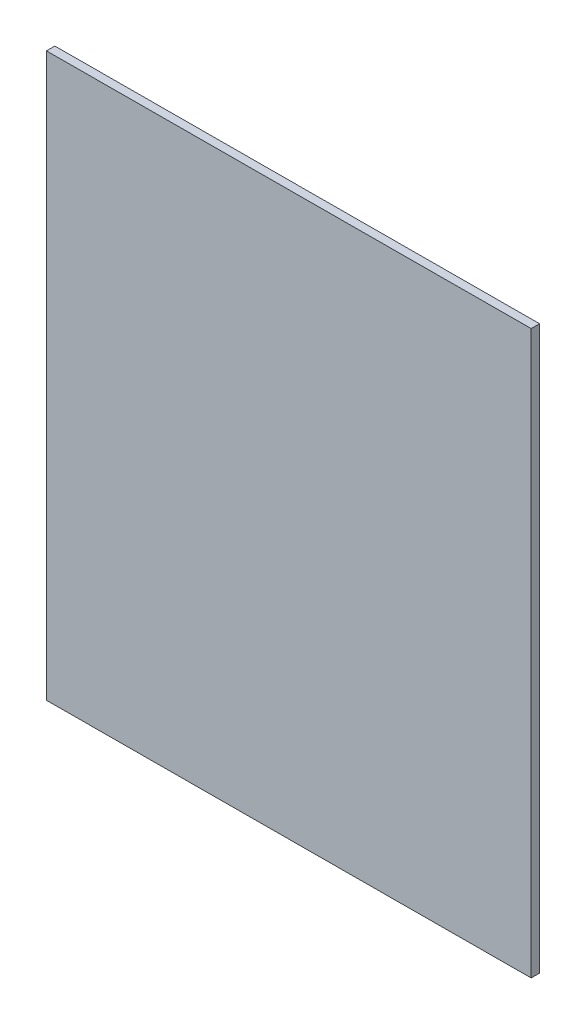
ISO-10303-21;
HEADER;
FILE_DESCRIPTION(('STEP AP214'),'2;1');
FILE_NAME('part.step','',(''),(''),'','','');
FILE_SCHEMA(('AUTOMOTIVE_DESIGN { 1 0 10303 214 1 1 1 1 }'));
ENDSEC;
DATA;
#1=APPLICATION_CONTEXT('core data for automotive mechanical design processes');
#2=APPLICATION_PROTOCOL_DEFINITION('international standard','automotive_design',2000,#1);
#3=PRODUCT_CONTEXT('',#1,'mechanical');
#4=PRODUCT('Part','Part','',(#3));
#5=PRODUCT_RELATED_PRODUCT_CATEGORY('part','',(#4));
#6=PRODUCT_DEFINITION_FORMATION('','',#4);
#7=PRODUCT_DEFINITION_CONTEXT('part definition',#1,'design');
#8=PRODUCT_DEFINITION('design','',#6,#7);
#9=PRODUCT_DEFINITION_SHAPE('','',#8);
#10=(LENGTH_UNIT() NAMED_UNIT(*) SI_UNIT(.MILLI.,.METRE.));
#11=(NAMED_UNIT(*) PLANE_ANGLE_UNIT() SI_UNIT($,.RADIAN.));
#12=(NAMED_UNIT(*) SI_UNIT($,.STERADIAN.) SOLID_ANGLE_UNIT());
#13=UNCERTAINTY_MEASURE_WITH_UNIT(LENGTH_MEASURE(1.E-05),#10,'distance_accuracy_value','');
#14=(GEOMETRIC_REPRESENTATION_CONTEXT(3) GLOBAL_UNCERTAINTY_ASSIGNED_CONTEXT((#13)) GLOBAL_UNIT_ASSIGNED_CONTEXT((#10,
#11,#12)) REPRESENTATION_CONTEXT('',''));
#15=CARTESIAN_POINT('',(0.,0.,0.));
#16=DIRECTION('',(0.,0.,1.));
#17=DIRECTION('',(1.,0.,0.));
#18=AXIS2_PLACEMENT_3D('',#15,#16,#17);
#19=CARTESIAN_POINT('',(-57.6000536662766,258.864031921605,-19.7746340834228));
#20=DIRECTION('',(0.,1.,0.));
#21=DIRECTION('',(0.,0.,1.));
#22=AXIS2_PLACEMENT_3D('',#19,#20,#21);
#23=PLANE('',#22);
#24=DIRECTION('',(0.999992480483627,0.,-0.00387801188796971));
#25=VECTOR('',#24,1.);
#26=CARTESIAN_POINT('',(-57.6078096900525,258.864031921605,-21.7746190443901));
#27=LINE('',#26,#25);
#28=CARTESIAN_POINT('',(-57.6078096900525,258.864031921605,-21.7746190443901));
#29=VERTEX_POINT('',#28);
#30=CARTESIAN_POINT('',(57.4371937720036,258.864031921605,-22.220768290294));
#31=VERTEX_POINT('',#30);
#32=EDGE_CURVE('E100',#29,#31,#27,.T.);
#33=ORIENTED_EDGE('',*,*,#32,.T.);
#34=DIRECTION('',(-0.00387801188796973,0.,-0.999992480483627));
#35=VECTOR('',#34,1.);
#36=CARTESIAN_POINT('',(57.4449497957795,258.864031921605,-20.2207833293267));
#37=LINE('',#36,#35);
#38=CARTESIAN_POINT('',(57.4449497957795,258.864031921605,-20.2207833293267));
#39=VERTEX_POINT('',#38);
#40=EDGE_CURVE('E11',#39,#31,#37,.T.);
#41=ORIENTED_EDGE('',*,*,#40,.F.);
#42=DIRECTION('',(0.999992480483627,0.,-0.00387801188796971));
#43=VECTOR('',#42,1.);
#44=CARTESIAN_POINT('',(-57.6000536662766,258.864031921605,-19.7746340834228));
#45=LINE('',#44,#43);
#46=CARTESIAN_POINT('',(-57.6000536662766,258.864031921605,-19.7746340834228));
#47=VERTEX_POINT('',#46);
#48=EDGE_CURVE('E88',#47,#39,#45,.T.);
#49=ORIENTED_EDGE('',*,*,#48,.F.);
#50=DIRECTION('',(-0.00387801188796973,0.,-0.999992480483627));
#51=VECTOR('',#50,1.);
#52=CARTESIAN_POINT('',(-57.6000536662766,258.864031921605,-19.7746340834228));
#53=LINE('',#52,#51);
#54=EDGE_CURVE('E96',#47,#29,#53,.T.);
#55=ORIENTED_EDGE('',*,*,#54,.T.);
#56=EDGE_LOOP('',(#33,#41,#49,#55));
#57=FACE_BOUND('',#56,.T.);
#58=ADVANCED_FACE('F37',(#57),#23,.F.);
#59=CARTESIAN_POINT('',(57.4449497957795,258.864031921605,-20.2207833293267));
#60=DIRECTION('',(-0.999992480483627,0.,0.00387801188796973));
#61=DIRECTION('',(0.00387801188796973,0.,0.999992480483627));
#62=AXIS2_PLACEMENT_3D('',#59,#60,#61);
#63=PLANE('',#62);
#64=DIRECTION('',(0.,1.,0.));
#65=VECTOR('',#64,1.);
#66=CARTESIAN_POINT('',(57.4371937720036,258.864031921605,-22.220768290294));
#67=LINE('',#66,#65);
#68=CARTESIAN_POINT('',(57.4371937720036,392.864031921605,-22.220768290294));
#69=VERTEX_POINT('',#68);
#70=EDGE_CURVE('E92',#31,#69,#67,.T.);
#71=ORIENTED_EDGE('',*,*,#70,.T.);
#72=DIRECTION('',(-0.00387801188796973,0.,-0.999992480483627));
#73=VECTOR('',#72,1.);
#74=CARTESIAN_POINT('',(57.4449497957795,392.864031921605,-20.2207833293267));
#75=LINE('',#74,#73);
#76=CARTESIAN_POINT('',(57.4449497957795,392.864031921605,-20.2207833293267));
#77=VERTEX_POINT('',#76);
#78=EDGE_CURVE('E45',#77,#69,#75,.T.);
#79=ORIENTED_EDGE('',*,*,#78,.F.);
#80=DIRECTION('',(0.,1.,0.));
#81=VECTOR('',#80,1.);
#82=CARTESIAN_POINT('',(57.4449497957795,258.864031921605,-20.2207833293267));
#83=LINE('',#82,#81);
#84=EDGE_CURVE('E83',#39,#77,#83,.T.);
#85=ORIENTED_EDGE('',*,*,#84,.F.);
#86=ORIENTED_EDGE('',*,*,#40,.T.);
#87=EDGE_LOOP('',(#71,#79,#85,#86));
#88=FACE_BOUND('',#87,.T.);
#89=ADVANCED_FACE('F91',(#88),#63,.F.);
#90=CARTESIAN_POINT('',(-57.6000536662766,392.864031921605,-19.7746340834228));
#91=DIRECTION('',(0.,-1.,0.));
#92=DIRECTION('',(0.,0.,-1.));
#93=AXIS2_PLACEMENT_3D('',#90,#91,#92);
#94=PLANE('',#93);
#95=DIRECTION('',(-0.999992480483627,0.,0.00387801188796971));
#96=VECTOR('',#95,1.);
#97=CARTESIAN_POINT('',(-57.6078096900525,392.864031921605,-21.7746190443901));
#98=LINE('',#97,#96);
#99=CARTESIAN_POINT('',(-57.6078096900525,392.864031921605,-21.7746190443901));
#100=VERTEX_POINT('',#99);
#101=EDGE_CURVE('E70',#69,#100,#98,.T.);
#102=ORIENTED_EDGE('',*,*,#101,.T.);
#103=DIRECTION('',(-0.00387801188796973,0.,-0.999992480483627));
#104=VECTOR('',#103,1.);
#105=CARTESIAN_POINT('',(-57.6000536662766,392.864031921605,-19.7746340834228));
#106=LINE('',#105,#104);
#107=CARTESIAN_POINT('',(-57.6000536662766,392.864031921605,-19.7746340834228));
#108=VERTEX_POINT('',#107);
#109=EDGE_CURVE('E93',#108,#100,#106,.T.);
#110=ORIENTED_EDGE('',*,*,#109,.F.);
#111=DIRECTION('',(-0.999992480483627,0.,0.00387801188796971));
#112=VECTOR('',#111,1.);
#113=CARTESIAN_POINT('',(-57.6000536662766,392.864031921605,-19.7746340834228));
#114=LINE('',#113,#112);
#115=EDGE_CURVE('E86',#77,#108,#114,.T.);
#116=ORIENTED_EDGE('',*,*,#115,.F.);
#117=ORIENTED_EDGE('',*,*,#78,.T.);
#118=EDGE_LOOP('',(#102,#110,#116,#117));
#119=FACE_BOUND('',#118,.T.);
#120=ADVANCED_FACE('F94',(#119),#94,.F.);
#121=CARTESIAN_POINT('',(-57.6000536662766,258.864031921605,-19.7746340834228));
#122=DIRECTION('',(0.999992480483627,0.,-0.00387801188796973));
#123=DIRECTION('',(-0.00387801188796973,0.,-0.999992480483627));
#124=AXIS2_PLACEMENT_3D('',#121,#122,#123);
#125=PLANE('',#124);
#126=DIRECTION('',(0.,-1.,0.));
#127=VECTOR('',#126,1.);
#128=CARTESIAN_POINT('',(-57.6078096900525,258.864031921605,-21.7746190443901));
#129=LINE('',#128,#127);
#130=EDGE_CURVE('E76',#100,#29,#129,.T.);
#131=ORIENTED_EDGE('',*,*,#130,.T.);
#132=ORIENTED_EDGE('',*,*,#54,.F.);
#133=DIRECTION('',(0.,-1.,0.));
#134=VECTOR('',#133,1.);
#135=CARTESIAN_POINT('',(-57.6000536662766,258.864031921605,-19.7746340834228));
#136=LINE('',#135,#134);
#137=EDGE_CURVE('E53',#108,#47,#136,.T.);
#138=ORIENTED_EDGE('',*,*,#137,.F.);
#139=ORIENTED_EDGE('',*,*,#109,.T.);
#140=EDGE_LOOP('',(#131,#132,#138,#139));
#141=FACE_BOUND('',#140,.T.);
#142=ADVANCED_FACE('F107',(#141),#125,.F.);
#143=CARTESIAN_POINT('',(-0.0775519352485235,0.,-19.9977087063748));
#144=DIRECTION('',(0.00387801188796971,0.,0.999992480483627));
#145=DIRECTION('',(0.999992480483627,0.,-0.00387801188796971));
#146=AXIS2_PLACEMENT_3D('',#143,#144,#145);
#147=PLANE('',#146);
#148=ORIENTED_EDGE('',*,*,#48,.T.);
#149=ORIENTED_EDGE('',*,*,#84,.T.);
#150=ORIENTED_EDGE('',*,*,#115,.T.);
#151=ORIENTED_EDGE('',*,*,#137,.T.);
#152=EDGE_LOOP('',(#148,#149,#150,#151));
#153=FACE_BOUND('',#152,.T.);
#154=ADVANCED_FACE('F84',(#153),#147,.T.);
#155=CARTESIAN_POINT('',(-0.085307959024463,0.,-21.997693667342));
#156=DIRECTION('',(0.00387801188796971,0.,0.999992480483627));
#157=DIRECTION('',(0.999992480483627,0.,-0.00387801188796971));
#158=AXIS2_PLACEMENT_3D('',#155,#156,#157);
#159=PLANE('',#158);
#160=ORIENTED_EDGE('',*,*,#32,.F.);
#161=ORIENTED_EDGE('',*,*,#130,.F.);
#162=ORIENTED_EDGE('',*,*,#101,.F.);
#163=ORIENTED_EDGE('',*,*,#70,.F.);
#164=EDGE_LOOP('',(#160,#161,#162,#163));
#165=FACE_BOUND('',#164,.T.);
#166=ADVANCED_FACE('F110',(#165),#159,.F.);
#167=CLOSED_SHELL('',(#58,#89,#120,#142,#154,#166));
#168=MANIFOLD_SOLID_BREP('B2',#167);
#169=ADVANCED_BREP_SHAPE_REPRESENTATION('',(#18,#168),#14);
#170=SHAPE_DEFINITION_REPRESENTATION(#9,#169);
ENDSEC;
END-ISO-10303-21;
